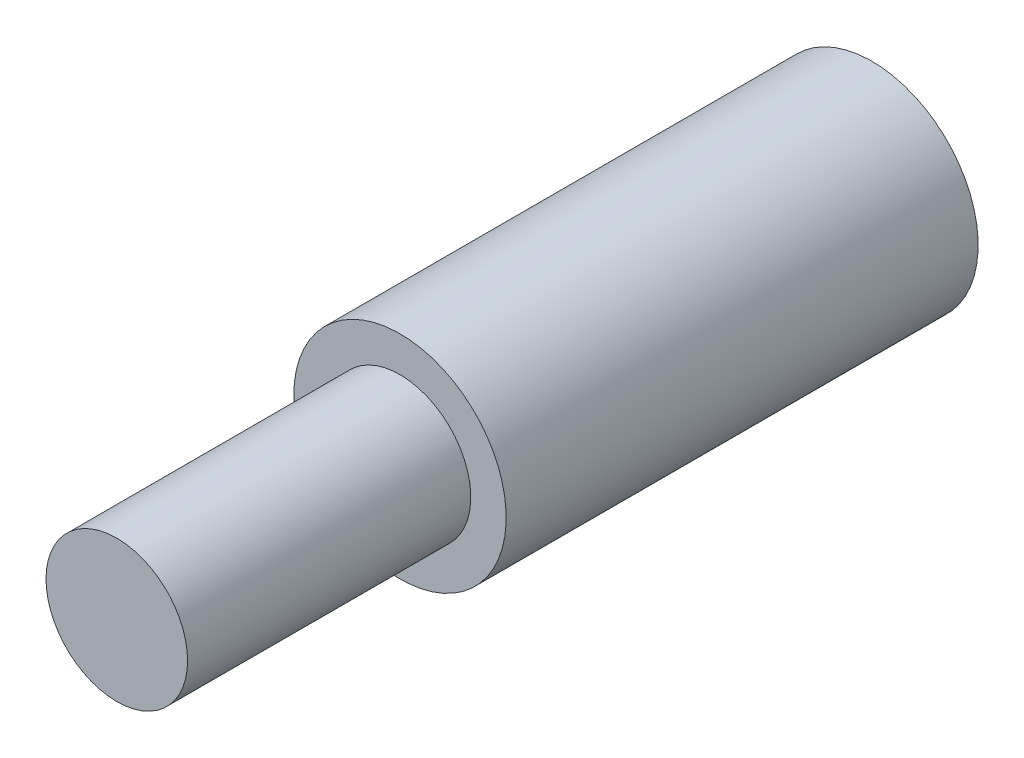
ISO-10303-21;
HEADER;
FILE_DESCRIPTION(('STEP AP214'),'2;1');
FILE_NAME('part.step','',(''),(''),'','','');
FILE_SCHEMA(('AUTOMOTIVE_DESIGN { 1 0 10303 214 1 1 1 1 }'));
ENDSEC;
DATA;
#1=APPLICATION_CONTEXT('core data for automotive mechanical design processes');
#2=APPLICATION_PROTOCOL_DEFINITION('international standard','automotive_design',2000,#1);
#3=PRODUCT_CONTEXT('',#1,'mechanical');
#4=PRODUCT('Part','Part','',(#3));
#5=PRODUCT_RELATED_PRODUCT_CATEGORY('part','',(#4));
#6=PRODUCT_DEFINITION_FORMATION('','',#4);
#7=PRODUCT_DEFINITION_CONTEXT('part definition',#1,'design');
#8=PRODUCT_DEFINITION('design','',#6,#7);
#9=PRODUCT_DEFINITION_SHAPE('','',#8);
#10=(LENGTH_UNIT() NAMED_UNIT(*) SI_UNIT(.MILLI.,.METRE.));
#11=(NAMED_UNIT(*) PLANE_ANGLE_UNIT() SI_UNIT($,.RADIAN.));
#12=(NAMED_UNIT(*) SI_UNIT($,.STERADIAN.) SOLID_ANGLE_UNIT());
#13=UNCERTAINTY_MEASURE_WITH_UNIT(LENGTH_MEASURE(1.E-05),#10,'distance_accuracy_value','');
#14=(GEOMETRIC_REPRESENTATION_CONTEXT(3) GLOBAL_UNCERTAINTY_ASSIGNED_CONTEXT((#13)) GLOBAL_UNIT_ASSIGNED_CONTEXT((#10,
#11,#12)) REPRESENTATION_CONTEXT('',''));
#15=CARTESIAN_POINT('',(0.,0.,0.));
#16=DIRECTION('',(0.,0.,1.));
#17=DIRECTION('',(1.,0.,0.));
#18=AXIS2_PLACEMENT_3D('',#15,#16,#17);
#19=CARTESIAN_POINT('',(0.,0.,6.));
#20=DIRECTION('',(0.,0.,-1.));
#21=DIRECTION('',(-1.,0.,0.));
#22=AXIS2_PLACEMENT_3D('',#19,#20,#21);
#23=CYLINDRICAL_SURFACE('',#22,1.5);
#24=CARTESIAN_POINT('',(0.,0.,6.));
#25=DIRECTION('',(0.,0.,1.));
#26=DIRECTION('',(1.,0.,0.));
#27=AXIS2_PLACEMENT_3D('',#24,#25,#26);
#28=CIRCLE('',#27,1.5);
#29=CARTESIAN_POINT('',(1.5,0.,6.));
#30=VERTEX_POINT('',#29);
#31=EDGE_CURVE('E10',#30,#30,#28,.T.);
#32=ORIENTED_EDGE('',*,*,#31,.F.);
#33=EDGE_LOOP('',(#32));
#34=FACE_BOUND('',#33,.T.);
#35=CARTESIAN_POINT('',(0.,0.,0.));
#36=DIRECTION('',(0.,0.,-1.));
#37=DIRECTION('',(-1.,0.,0.));
#38=AXIS2_PLACEMENT_3D('',#35,#36,#37);
#39=CIRCLE('',#38,1.5);
#40=CARTESIAN_POINT('',(-1.5,0.,0.));
#41=VERTEX_POINT('',#40);
#42=EDGE_CURVE('E39',#41,#41,#39,.T.);
#43=ORIENTED_EDGE('',*,*,#42,.F.);
#44=EDGE_LOOP('',(#43));
#45=FACE_BOUND('',#44,.T.);
#46=ADVANCED_FACE('F33',(#34,#45),#23,.T.);
#47=CARTESIAN_POINT('',(0.,0.,6.));
#48=DIRECTION('',(0.,0.,1.));
#49=DIRECTION('',(1.,0.,0.));
#50=AXIS2_PLACEMENT_3D('',#47,#48,#49);
#51=PLANE('',#50);
#52=ORIENTED_EDGE('',*,*,#31,.T.);
#53=EDGE_LOOP('',(#52));
#54=FACE_BOUND('',#53,.T.);
#55=ADVANCED_FACE('F81',(#54),#51,.T.);
#56=CARTESIAN_POINT('',(0.,0.,0.));
#57=DIRECTION('',(0.,0.,-1.));
#58=DIRECTION('',(-1.,0.,0.));
#59=AXIS2_PLACEMENT_3D('',#56,#57,#58);
#60=PLANE('',#59);
#61=CARTESIAN_POINT('',(0.,0.,0.));
#62=DIRECTION('',(0.,0.,-1.));
#63=DIRECTION('',(-1.,0.,0.));
#64=AXIS2_PLACEMENT_3D('',#61,#62,#63);
#65=CIRCLE('',#64,2.25);
#66=CARTESIAN_POINT('',(-2.25,0.,0.));
#67=VERTEX_POINT('',#66);
#68=EDGE_CURVE('E47',#67,#67,#65,.T.);
#69=ORIENTED_EDGE('',*,*,#68,.F.);
#70=EDGE_LOOP('',(#69));
#71=FACE_BOUND('',#70,.T.);
#72=ORIENTED_EDGE('',*,*,#42,.T.);
#73=EDGE_LOOP('',(#72));
#74=FACE_BOUND('',#73,.T.);
#75=ADVANCED_FACE('F76',(#71,#74),#60,.F.);
#76=CARTESIAN_POINT('',(0.,0.,-10.));
#77=DIRECTION('',(0.,0.,1.));
#78=DIRECTION('',(1.,0.,0.));
#79=AXIS2_PLACEMENT_3D('',#76,#77,#78);
#80=CYLINDRICAL_SURFACE('',#79,2.25);
#81=CARTESIAN_POINT('',(0.,0.,-10.));
#82=DIRECTION('',(0.,0.,-1.));
#83=DIRECTION('',(-1.,0.,0.));
#84=AXIS2_PLACEMENT_3D('',#81,#82,#83);
#85=CIRCLE('',#84,2.25);
#86=CARTESIAN_POINT('',(-2.25,0.,-10.));
#87=VERTEX_POINT('',#86);
#88=EDGE_CURVE('E43',#87,#87,#85,.T.);
#89=ORIENTED_EDGE('',*,*,#88,.F.);
#90=EDGE_LOOP('',(#89));
#91=FACE_BOUND('',#90,.T.);
#92=ORIENTED_EDGE('',*,*,#68,.T.);
#93=EDGE_LOOP('',(#92));
#94=FACE_BOUND('',#93,.T.);
#95=ADVANCED_FACE('F70',(#91,#94),#80,.T.);
#96=CARTESIAN_POINT('',(0.,0.,-10.));
#97=DIRECTION('',(0.,0.,-1.));
#98=DIRECTION('',(-1.,0.,0.));
#99=AXIS2_PLACEMENT_3D('',#96,#97,#98);
#100=PLANE('',#99);
#101=CARTESIAN_POINT('',(0.,0.,-10.));
#102=DIRECTION('',(0.,0.,-1.));
#103=DIRECTION('',(-1.,0.,0.));
#104=AXIS2_PLACEMENT_3D('',#101,#102,#103);
#105=CIRCLE('',#104,1.5);
#106=CARTESIAN_POINT('',(-1.5,0.,-10.));
#107=VERTEX_POINT('',#106);
#108=EDGE_CURVE('E53',#107,#107,#105,.T.);
#109=ORIENTED_EDGE('',*,*,#108,.F.);
#110=EDGE_LOOP('',(#109));
#111=FACE_BOUND('',#110,.T.);
#112=ORIENTED_EDGE('',*,*,#88,.T.);
#113=EDGE_LOOP('',(#112));
#114=FACE_BOUND('',#113,.T.);
#115=ADVANCED_FACE('F64',(#111,#114),#100,.T.);
#116=CARTESIAN_POINT('',(0.,0.,-6.));
#117=DIRECTION('',(0.,0.,-1.));
#118=DIRECTION('',(-1.,0.,0.));
#119=AXIS2_PLACEMENT_3D('',#116,#117,#118);
#120=CYLINDRICAL_SURFACE('',#119,1.5);
#121=CARTESIAN_POINT('',(0.,0.,-6.));
#122=DIRECTION('',(0.,0.,-1.));
#123=DIRECTION('',(-1.,0.,0.));
#124=AXIS2_PLACEMENT_3D('',#121,#122,#123);
#125=CIRCLE('',#124,1.5);
#126=CARTESIAN_POINT('',(-1.5,0.,-6.));
#127=VERTEX_POINT('',#126);
#128=EDGE_CURVE('E51',#127,#127,#125,.T.);
#129=ORIENTED_EDGE('',*,*,#128,.F.);
#130=EDGE_LOOP('',(#129));
#131=FACE_BOUND('',#130,.T.);
#132=ORIENTED_EDGE('',*,*,#108,.T.);
#133=EDGE_LOOP('',(#132));
#134=FACE_BOUND('',#133,.T.);
#135=ADVANCED_FACE('F61',(#131,#134),#120,.F.);
#136=CARTESIAN_POINT('',(0.,0.,-6.));
#137=DIRECTION('',(0.,0.,-1.));
#138=DIRECTION('',(-1.,0.,0.));
#139=AXIS2_PLACEMENT_3D('',#136,#137,#138);
#140=PLANE('',#139);
#141=ORIENTED_EDGE('',*,*,#128,.T.);
#142=EDGE_LOOP('',(#141));
#143=FACE_BOUND('',#142,.T.);
#144=ADVANCED_FACE('F59',(#143),#140,.T.);
#145=CLOSED_SHELL('',(#46,#55,#75,#95,#115,#135,#144));
#146=MANIFOLD_SOLID_BREP('B2',#145);
#147=ADVANCED_BREP_SHAPE_REPRESENTATION('',(#18,#146),#14);
#148=SHAPE_DEFINITION_REPRESENTATION(#9,#147);
ENDSEC;
END-ISO-10303-21;
